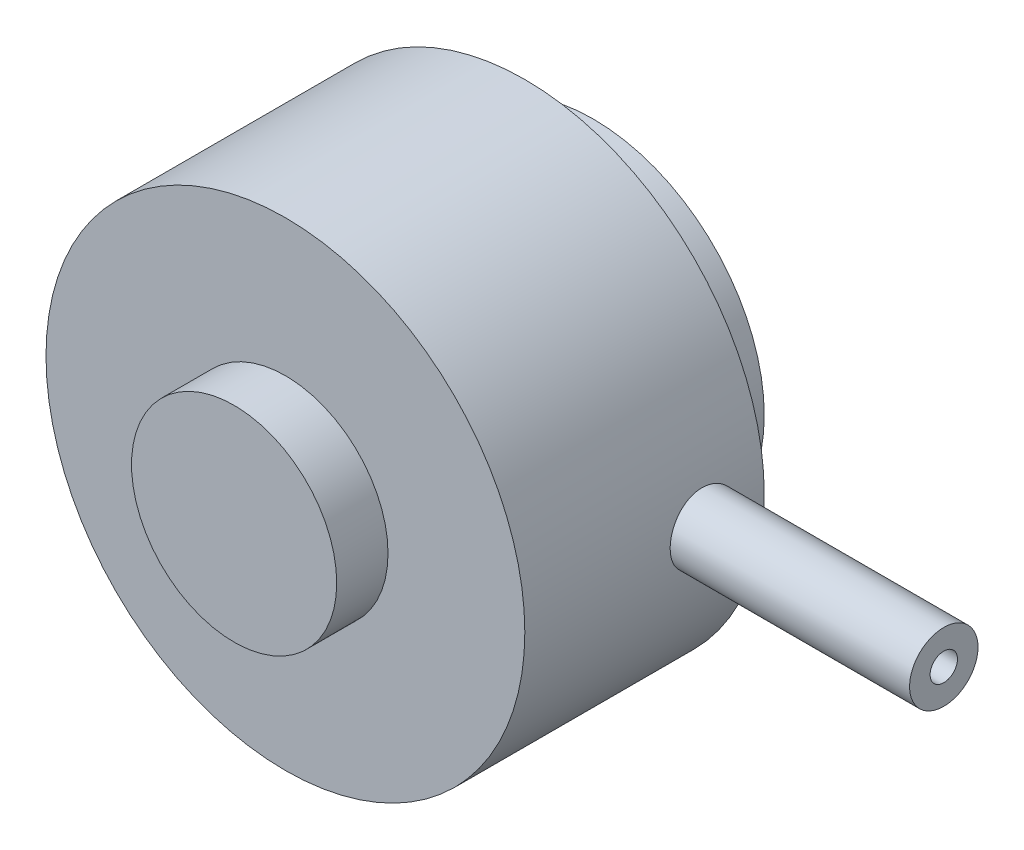
ISO-10303-21;
HEADER;
FILE_DESCRIPTION(('STEP AP214'),'2;1');
FILE_NAME('part.step','',(''),(''),'','','');
FILE_SCHEMA(('AUTOMOTIVE_DESIGN { 1 0 10303 214 1 1 1 1 }'));
ENDSEC;
DATA;
#1=APPLICATION_CONTEXT('core data for automotive mechanical design processes');
#2=APPLICATION_PROTOCOL_DEFINITION('international standard','automotive_design',2000,#1);
#3=PRODUCT_CONTEXT('',#1,'mechanical');
#4=PRODUCT('Part','Part','',(#3));
#5=PRODUCT_RELATED_PRODUCT_CATEGORY('part','',(#4));
#6=PRODUCT_DEFINITION_FORMATION('','',#4);
#7=PRODUCT_DEFINITION_CONTEXT('part definition',#1,'design');
#8=PRODUCT_DEFINITION('design','',#6,#7);
#9=PRODUCT_DEFINITION_SHAPE('','',#8);
#10=(LENGTH_UNIT() NAMED_UNIT(*) SI_UNIT(.MILLI.,.METRE.));
#11=(NAMED_UNIT(*) PLANE_ANGLE_UNIT() SI_UNIT($,.RADIAN.));
#12=(NAMED_UNIT(*) SI_UNIT($,.STERADIAN.) SOLID_ANGLE_UNIT());
#13=UNCERTAINTY_MEASURE_WITH_UNIT(LENGTH_MEASURE(1.E-05),#10,'distance_accuracy_value','');
#14=(GEOMETRIC_REPRESENTATION_CONTEXT(3) GLOBAL_UNCERTAINTY_ASSIGNED_CONTEXT((#13)) GLOBAL_UNIT_ASSIGNED_CONTEXT((#10,
#11,#12)) REPRESENTATION_CONTEXT('',''));
#15=CARTESIAN_POINT('',(0.,0.,0.));
#16=DIRECTION('',(0.,0.,1.));
#17=DIRECTION('',(1.,0.,0.));
#18=AXIS2_PLACEMENT_3D('',#15,#16,#17);
#19=CARTESIAN_POINT('',(0.,0.,9.));
#20=DIRECTION('',(0.,0.,-1.));
#21=DIRECTION('',(-1.,0.,0.));
#22=AXIS2_PLACEMENT_3D('',#19,#20,#21);
#23=CYLINDRICAL_SURFACE('',#22,7.);
#24=CARTESIAN_POINT('',(0.,0.,9.));
#25=DIRECTION('',(0.,0.,1.));
#26=DIRECTION('',(1.,0.,0.));
#27=AXIS2_PLACEMENT_3D('',#24,#25,#26);
#28=CIRCLE('',#27,7.);
#29=CARTESIAN_POINT('',(7.,0.,9.));
#30=VERTEX_POINT('',#29);
#31=EDGE_CURVE('E60',#30,#30,#28,.T.);
#32=ORIENTED_EDGE('',*,*,#31,.F.);
#33=EDGE_LOOP('',(#32));
#34=FACE_BOUND('',#33,.T.);
#35=CARTESIAN_POINT('',(0.,0.,2.));
#36=DIRECTION('',(0.,0.,1.));
#37=DIRECTION('',(1.,0.,0.));
#38=AXIS2_PLACEMENT_3D('',#35,#36,#37);
#39=CIRCLE('',#38,7.);
#40=CARTESIAN_POINT('',(7.,0.,2.));
#41=VERTEX_POINT('',#40);
#42=EDGE_CURVE('E63',#41,#41,#39,.T.);
#43=ORIENTED_EDGE('',*,*,#42,.T.);
#44=EDGE_LOOP('',(#43));
#45=FACE_BOUND('',#44,.T.);
#46=CARTESIAN_POINT('',(7.,0.,4.75));
#47=CARTESIAN_POINT('',(6.99999913522882,-0.0558653647064107,4.74999767341119));
#48=CARTESIAN_POINT('',(6.99932420200296,-0.111763905495517,4.7453027928406));
#49=CARTESIAN_POINT('',(6.99669670505877,-0.222000660368081,4.72665086376601));
#50=CARTESIAN_POINT('',(6.99474286996306,-0.276337265533478,4.71268459822962));
#51=CARTESIAN_POINT('',(6.98977730161823,-0.381838676785442,4.67591393826577));
#52=CARTESIAN_POINT('',(6.98676634168295,-0.433005769349771,4.65311600317349));
#53=CARTESIAN_POINT('',(6.98001989080586,-0.530779650240318,4.59934445710464));
#54=CARTESIAN_POINT('',(6.97628450765023,-0.57738711543865,4.56837206215042));
#55=CARTESIAN_POINT('',(6.96847539120891,-0.665058650397312,4.49889582883273));
#56=CARTESIAN_POINT('',(6.96439965767478,-0.70608559080065,4.46034535714209));
#57=CARTESIAN_POINT('',(6.95638499821218,-0.781111291768628,4.37690758546034));
#58=CARTESIAN_POINT('',(6.95244607987804,-0.815109662708697,4.33201993440348));
#59=CARTESIAN_POINT('',(6.94513156490684,-0.875255876422228,4.23693488394625));
#60=CARTESIAN_POINT('',(6.94175855199628,-0.901368125473884,4.18671475371485));
#61=CARTESIAN_POINT('',(6.93598482656287,-0.944773451668098,4.08254546050895));
#62=CARTESIAN_POINT('',(6.93358406600217,-0.962066964544983,4.02859648192668));
#63=CARTESIAN_POINT('',(6.93004619376593,-0.987229320061167,3.91888999017198));
#64=CARTESIAN_POINT('',(6.92890059523603,-0.995161488527954,3.86314728007218));
#65=CARTESIAN_POINT('',(6.92797693845422,-1.00157210007568,3.7511110945652));
#66=CARTESIAN_POINT('',(6.92819880887042,-1.00005103626979,3.69481764803928));
#67=CARTESIAN_POINT('',(6.9299772577103,-0.98765018097941,3.58372345466693));
#68=CARTESIAN_POINT('',(6.9315238110212,-0.976840681796494,3.52891467795415));
#69=CARTESIAN_POINT('',(6.93576171689508,-0.946279723214286,3.42189691371574));
#70=CARTESIAN_POINT('',(6.9384530990754,-0.926528032474813,3.36968799348884));
#71=CARTESIAN_POINT('',(6.94468857735278,-0.878569521249536,3.26913672689157));
#72=CARTESIAN_POINT('',(6.94823569081255,-0.850332693116339,3.2208088876142));
#73=CARTESIAN_POINT('',(6.95578073890064,-0.786226845720379,3.1295507878107));
#74=CARTESIAN_POINT('',(6.95977870039515,-0.750357371512553,3.08662084927006));
#75=CARTESIAN_POINT('',(6.9678193568045,-0.671617458714389,3.00696959688537));
#76=CARTESIAN_POINT('',(6.97186212884533,-0.628686537577609,2.97030805494004));
#77=CARTESIAN_POINT('',(6.97950317895594,-0.537249159400889,2.90470149877674));
#78=CARTESIAN_POINT('',(6.98310145539225,-0.48874268187249,2.87575651291603));
#79=CARTESIAN_POINT('',(6.98945135313469,-0.387481039813844,2.82640256250071));
#80=CARTESIAN_POINT('',(6.99220254306019,-0.334723727733655,2.80599794525287));
#81=CARTESIAN_POINT('',(6.99654459946019,-0.226483349377098,2.77435453068025));
#82=CARTESIAN_POINT('',(6.99813553702157,-0.171000450315641,2.76311517180909));
#83=CARTESIAN_POINT('',(6.99996847286368,-0.0594000111949728,2.75020018658979));
#84=CARTESIAN_POINT('',(7.00022206812239,-0.00329216977119546,2.74844233676575));
#85=CARTESIAN_POINT('',(6.9993832363385,0.108417425156648,2.75432240401004));
#86=CARTESIAN_POINT('',(6.99829084698658,0.164019192788029,2.76196005798254));
#87=CARTESIAN_POINT('',(6.99488996866151,0.272891208992244,2.78634597079736));
#88=CARTESIAN_POINT('',(6.99258679365044,0.326170552460061,2.80305442958978));
#89=CARTESIAN_POINT('',(6.98702187136217,0.429171472012341,2.84506586964771));
#90=CARTESIAN_POINT('',(6.98376008274315,0.47889289454054,2.87036922158957));
#91=CARTESIAN_POINT('',(6.97661188585467,0.573729847898929,2.92904690849373));
#92=CARTESIAN_POINT('',(6.97272147424604,0.618812606348984,2.96247371485273));
#93=CARTESIAN_POINT('',(6.96476223215387,0.70275764740243,3.03637603802613));
#94=CARTESIAN_POINT('',(6.96069339232073,0.741619603539291,3.07685192454233));
#95=CARTESIAN_POINT('',(6.95279940084852,0.812316823103835,3.16406835048223));
#96=CARTESIAN_POINT('',(6.94897630774254,0.844097150424189,3.21085363515026));
#97=CARTESIAN_POINT('',(6.94204235740405,0.899347843769573,3.309146593302));
#98=CARTESIAN_POINT('',(6.9389314823679,0.922818417525415,3.36065414869581));
#99=CARTESIAN_POINT('',(6.93378885130881,0.960697053792666,3.46676165225315));
#100=CARTESIAN_POINT('',(6.93175358189617,0.975134650659852,3.52135087942065));
#101=CARTESIAN_POINT('',(6.92898304632217,0.994631866000765,3.6322102805278));
#102=CARTESIAN_POINT('',(6.92824769941436,0.999692066965096,3.68848034983884));
#103=CARTESIAN_POINT('',(6.92816308872538,1.00027795187105,3.80055691326065));
#104=CARTESIAN_POINT('',(6.92880127161589,0.995889986839031,3.85636296582766));
#105=CARTESIAN_POINT('',(6.9313646210599,0.977888479253999,3.96643506202923));
#106=CARTESIAN_POINT('',(6.93328978628734,0.964274946206753,4.02070110725051));
#107=CARTESIAN_POINT('',(6.93820594738757,0.92823822782898,4.12613263255559));
#108=CARTESIAN_POINT('',(6.94119628108845,0.905820514813007,4.17730001588152));
#109=CARTESIAN_POINT('',(6.94790672863692,0.852820321015437,4.2751612224767));
#110=CARTESIAN_POINT('',(6.95162686252979,0.822237615959198,4.3218549228157));
#111=CARTESIAN_POINT('',(6.95941831326445,0.753459737315476,4.40988290926446));
#112=CARTESIAN_POINT('',(6.96349241131826,0.715200464701825,4.45116687260112));
#113=CARTESIAN_POINT('',(6.97150911027032,0.632290756660575,4.52675985371612));
#114=CARTESIAN_POINT('',(6.97545168026666,0.58763883216747,4.56106724189425));
#115=CARTESIAN_POINT('',(6.98278331246282,0.492951712266922,4.62188378601807));
#116=CARTESIAN_POINT('',(6.98616952559765,0.442890858727148,4.64835332707895));
#117=CARTESIAN_POINT('',(6.99197878037442,0.339010644185017,4.69246987200305));
#118=CARTESIAN_POINT('',(6.99440283401541,0.28519530259949,4.71012615071619));
#119=CARTESIAN_POINT('',(6.99745181502523,0.192605681998778,4.73204179345631));
#120=CARTESIAN_POINT('',(6.99840255428231,0.154406949589286,4.73876601846912));
#121=CARTESIAN_POINT('',(6.99967694328895,0.0774774606828308,4.7477459045441));
#122=CARTESIAN_POINT('',(7.00000059978196,0.0387467099115305,4.75000161365924));
#123=CARTESIAN_POINT('',(7.,0.,4.75));
#124=B_SPLINE_CURVE_WITH_KNOTS('',3,(#46,#47,#48,#49,#50,#51,#52,#53,#54,#55,#56,#57,#58,#59,
#60,#61,#62,#63,#64,#65,#66,#67,#68,#69,#70,#71,#72,#73,#74,#75,#76,#77,#78,#79,#80,#81,#82,#83,
#84,#85,#86,#87,#88,#89,#90,#91,#92,#93,#94,#95,#96,#97,#98,#99,#100,#101,#102,#103,#104,#105,
#106,#107,#108,#109,#110,#111,#112,#113,#114,#115,#116,#117,#118,#119,#120,#121,#122,#123),
.UNSPECIFIED.,.T.,.F.,(4,2,2,2,2,2,2,2,2,2,2,2,2,2,2,2,2,2,2,2,2,2,2,2,2,2,2,2,2,2,2,2,2,2,2,2,
2,2,4),(0.,0.167454526676439,0.335075775995835,0.502574660696852,0.670048642505171,
0.838587434288068,1.00713556641494,1.17643344042558,1.34572294860658,1.51386059320977,
1.68198946724779,1.84885708289861,2.01572901576745,2.1831981781095,2.35067732527464,
2.51967378353348,2.6886708628223,2.85775386243831,3.02682650172624,3.19443056043042,
3.3620299259403,3.5288997886847,3.69577684902495,3.86376187993315,4.03175572377582,
4.20101062362346,4.37026129206513,4.53895564370425,4.70763951629676,4.87478825923561,
5.0419368299494,5.20898167202542,5.37603110293353,5.54453823754737,5.71308468724557,
5.88246902499656,6.05167472923067,6.1678179205788,6.28395986295406),.UNSPECIFIED.);
#125=CARTESIAN_POINT('',(7.,0.,4.75));
#126=VERTEX_POINT('',#125);
#127=EDGE_CURVE('E10',#126,#126,#124,.T.);
#128=ORIENTED_EDGE('',*,*,#127,.F.);
#129=EDGE_LOOP('',(#128));
#130=FACE_BOUND('',#129,.T.);
#131=ADVANCED_FACE('F33',(#34,#45,#130),#23,.T.);
#132=CARTESIAN_POINT('',(0.,0.,2.));
#133=DIRECTION('',(0.,0.,-1.));
#134=DIRECTION('',(-1.,0.,0.));
#135=AXIS2_PLACEMENT_3D('',#132,#133,#134);
#136=CYLINDRICAL_SURFACE('',#135,5.);
#137=CARTESIAN_POINT('',(0.,0.,2.));
#138=DIRECTION('',(0.,0.,1.));
#139=DIRECTION('',(1.,0.,0.));
#140=AXIS2_PLACEMENT_3D('',#137,#138,#139);
#141=CIRCLE('',#140,5.);
#142=CARTESIAN_POINT('',(5.,0.,2.));
#143=VERTEX_POINT('',#142);
#144=EDGE_CURVE('E49',#143,#143,#141,.T.);
#145=ORIENTED_EDGE('',*,*,#144,.F.);
#146=EDGE_LOOP('',(#145));
#147=FACE_BOUND('',#146,.T.);
#148=CARTESIAN_POINT('',(0.,0.,0.));
#149=DIRECTION('',(0.,0.,1.));
#150=DIRECTION('',(1.,0.,0.));
#151=AXIS2_PLACEMENT_3D('',#148,#149,#150);
#152=CIRCLE('',#151,5.);
#153=CARTESIAN_POINT('',(5.,0.,0.));
#154=VERTEX_POINT('',#153);
#155=EDGE_CURVE('E54',#154,#154,#152,.T.);
#156=ORIENTED_EDGE('',*,*,#155,.T.);
#157=EDGE_LOOP('',(#156));
#158=FACE_BOUND('',#157,.T.);
#159=ADVANCED_FACE('F35',(#147,#158),#136,.T.);
#160=CARTESIAN_POINT('',(0.,0.,0.));
#161=DIRECTION('',(0.,0.,1.));
#162=DIRECTION('',(1.,0.,0.));
#163=AXIS2_PLACEMENT_3D('',#160,#161,#162);
#164=PLANE('',#163);
#165=CARTESIAN_POINT('',(0.,2.,0.));
#166=DIRECTION('',(0.,0.,-1.));
#167=DIRECTION('',(-1.,0.,0.));
#168=AXIS2_PLACEMENT_3D('',#165,#166,#167);
#169=CIRCLE('',#168,0.35);
#170=CARTESIAN_POINT('',(-0.35,2.,0.));
#171=VERTEX_POINT('',#170);
#172=EDGE_CURVE('E222',#171,#171,#169,.T.);
#173=ORIENTED_EDGE('',*,*,#172,.F.);
#174=EDGE_LOOP('',(#173));
#175=FACE_BOUND('',#174,.T.);
#176=CARTESIAN_POINT('',(0.,-2.,0.));
#177=DIRECTION('',(0.,0.,-1.));
#178=DIRECTION('',(-1.,0.,0.));
#179=AXIS2_PLACEMENT_3D('',#176,#177,#178);
#180=CIRCLE('',#179,0.35);
#181=CARTESIAN_POINT('',(-0.35,-2.,0.));
#182=VERTEX_POINT('',#181);
#183=EDGE_CURVE('E228',#182,#182,#180,.T.);
#184=ORIENTED_EDGE('',*,*,#183,.F.);
#185=EDGE_LOOP('',(#184));
#186=FACE_BOUND('',#185,.T.);
#187=CARTESIAN_POINT('',(-2.,0.,0.));
#188=DIRECTION('',(0.,0.,-1.));
#189=DIRECTION('',(-1.,0.,0.));
#190=AXIS2_PLACEMENT_3D('',#187,#188,#189);
#191=CIRCLE('',#190,0.35);
#192=CARTESIAN_POINT('',(-2.35,0.,0.));
#193=VERTEX_POINT('',#192);
#194=EDGE_CURVE('E234',#193,#193,#191,.T.);
#195=ORIENTED_EDGE('',*,*,#194,.F.);
#196=EDGE_LOOP('',(#195));
#197=FACE_BOUND('',#196,.T.);
#198=CARTESIAN_POINT('',(-2.,2.,0.));
#199=DIRECTION('',(0.,0.,-1.));
#200=DIRECTION('',(-1.,0.,0.));
#201=AXIS2_PLACEMENT_3D('',#198,#199,#200);
#202=CIRCLE('',#201,0.35);
#203=CARTESIAN_POINT('',(-2.35,2.,0.));
#204=VERTEX_POINT('',#203);
#205=EDGE_CURVE('E212',#204,#204,#202,.T.);
#206=ORIENTED_EDGE('',*,*,#205,.F.);
#207=EDGE_LOOP('',(#206));
#208=FACE_BOUND('',#207,.T.);
#209=CARTESIAN_POINT('',(2.,-2.00000000000001,0.));
#210=DIRECTION('',(0.,0.,-1.));
#211=DIRECTION('',(-1.,0.,0.));
#212=AXIS2_PLACEMENT_3D('',#209,#210,#211);
#213=CIRCLE('',#212,0.35);
#214=CARTESIAN_POINT('',(1.65,-2.00000000000001,0.));
#215=VERTEX_POINT('',#214);
#216=EDGE_CURVE('E206',#215,#215,#213,.T.);
#217=ORIENTED_EDGE('',*,*,#216,.F.);
#218=EDGE_LOOP('',(#217));
#219=FACE_BOUND('',#218,.T.);
#220=CARTESIAN_POINT('',(2.,1.99999999999999,0.));
#221=DIRECTION('',(0.,0.,-1.));
#222=DIRECTION('',(-1.,0.,0.));
#223=AXIS2_PLACEMENT_3D('',#220,#221,#222);
#224=CIRCLE('',#223,0.35);
#225=CARTESIAN_POINT('',(1.65,1.99999999999999,0.));
#226=VERTEX_POINT('',#225);
#227=EDGE_CURVE('E195',#226,#226,#224,.T.);
#228=ORIENTED_EDGE('',*,*,#227,.F.);
#229=EDGE_LOOP('',(#228));
#230=FACE_BOUND('',#229,.T.);
#231=CARTESIAN_POINT('',(2.,0.,0.));
#232=DIRECTION('',(0.,0.,-1.));
#233=DIRECTION('',(-1.,0.,0.));
#234=AXIS2_PLACEMENT_3D('',#231,#232,#233);
#235=CIRCLE('',#234,0.35);
#236=CARTESIAN_POINT('',(1.65,0.,0.));
#237=VERTEX_POINT('',#236);
#238=EDGE_CURVE('E194',#237,#237,#235,.T.);
#239=ORIENTED_EDGE('',*,*,#238,.F.);
#240=EDGE_LOOP('',(#239));
#241=FACE_BOUND('',#240,.T.);
#242=CARTESIAN_POINT('',(-2.,-2.,0.));
#243=DIRECTION('',(0.,0.,-1.));
#244=DIRECTION('',(-1.,0.,0.));
#245=AXIS2_PLACEMENT_3D('',#242,#243,#244);
#246=CIRCLE('',#245,0.35);
#247=CARTESIAN_POINT('',(-2.35,-2.,0.));
#248=VERTEX_POINT('',#247);
#249=EDGE_CURVE('E213',#248,#248,#246,.T.);
#250=ORIENTED_EDGE('',*,*,#249,.F.);
#251=EDGE_LOOP('',(#250));
#252=FACE_BOUND('',#251,.T.);
#253=CARTESIAN_POINT('',(0.,0.,0.));
#254=DIRECTION('',(0.,0.,-1.));
#255=DIRECTION('',(-1.,0.,0.));
#256=AXIS2_PLACEMENT_3D('',#253,#254,#255);
#257=CIRCLE('',#256,0.35);
#258=CARTESIAN_POINT('',(-0.35,0.,0.));
#259=VERTEX_POINT('',#258);
#260=EDGE_CURVE('E221',#259,#259,#257,.T.);
#261=ORIENTED_EDGE('',*,*,#260,.F.);
#262=EDGE_LOOP('',(#261));
#263=FACE_BOUND('',#262,.T.);
#264=ORIENTED_EDGE('',*,*,#155,.F.);
#265=EDGE_LOOP('',(#264));
#266=FACE_BOUND('',#265,.T.);
#267=ADVANCED_FACE('F69',(#175,#186,#197,#208,#219,#230,#241,#252,#263,#266),#164,.F.);
#268=CARTESIAN_POINT('',(0.,0.,9.));
#269=DIRECTION('',(0.,0.,1.));
#270=DIRECTION('',(1.,0.,0.));
#271=AXIS2_PLACEMENT_3D('',#268,#269,#270);
#272=PLANE('',#271);
#273=CARTESIAN_POINT('',(0.,0.,9.));
#274=DIRECTION('',(0.,0.,1.));
#275=DIRECTION('',(1.,0.,0.));
#276=AXIS2_PLACEMENT_3D('',#273,#274,#275);
#277=CIRCLE('',#276,3.);
#278=CARTESIAN_POINT('',(3.,0.,9.));
#279=VERTEX_POINT('',#278);
#280=EDGE_CURVE('E45',#279,#279,#277,.T.);
#281=ORIENTED_EDGE('',*,*,#280,.F.);
#282=EDGE_LOOP('',(#281));
#283=FACE_BOUND('',#282,.T.);
#284=ORIENTED_EDGE('',*,*,#31,.T.);
#285=EDGE_LOOP('',(#284));
#286=FACE_BOUND('',#285,.T.);
#287=ADVANCED_FACE('F71',(#283,#286),#272,.T.);
#288=CARTESIAN_POINT('',(0.,0.,2.));
#289=DIRECTION('',(0.,0.,1.));
#290=DIRECTION('',(1.,0.,0.));
#291=AXIS2_PLACEMENT_3D('',#288,#289,#290);
#292=PLANE('',#291);
#293=ORIENTED_EDGE('',*,*,#144,.T.);
#294=EDGE_LOOP('',(#293));
#295=FACE_BOUND('',#294,.T.);
#296=ORIENTED_EDGE('',*,*,#42,.F.);
#297=EDGE_LOOP('',(#296));
#298=FACE_BOUND('',#297,.T.);
#299=ADVANCED_FACE('F77',(#295,#298),#292,.F.);
#300=CARTESIAN_POINT('',(0.,0.,10.5));
#301=DIRECTION('',(0.,0.,-1.));
#302=DIRECTION('',(-1.,0.,0.));
#303=AXIS2_PLACEMENT_3D('',#300,#301,#302);
#304=CYLINDRICAL_SURFACE('',#303,3.);
#305=CARTESIAN_POINT('',(0.,0.,10.5));
#306=DIRECTION('',(0.,0.,1.));
#307=DIRECTION('',(1.,0.,0.));
#308=AXIS2_PLACEMENT_3D('',#305,#306,#307);
#309=CIRCLE('',#308,3.);
#310=CARTESIAN_POINT('',(3.,0.,10.5));
#311=VERTEX_POINT('',#310);
#312=EDGE_CURVE('E58',#311,#311,#309,.T.);
#313=ORIENTED_EDGE('',*,*,#312,.F.);
#314=EDGE_LOOP('',(#313));
#315=FACE_BOUND('',#314,.T.);
#316=ORIENTED_EDGE('',*,*,#280,.T.);
#317=EDGE_LOOP('',(#316));
#318=FACE_BOUND('',#317,.T.);
#319=ADVANCED_FACE('F92',(#315,#318),#304,.T.);
#320=CARTESIAN_POINT('',(0.,0.,10.5));
#321=DIRECTION('',(0.,0.,1.));
#322=DIRECTION('',(1.,0.,0.));
#323=AXIS2_PLACEMENT_3D('',#320,#321,#322);
#324=PLANE('',#323);
#325=ORIENTED_EDGE('',*,*,#312,.T.);
#326=EDGE_LOOP('',(#325));
#327=FACE_BOUND('',#326,.T.);
#328=ADVANCED_FACE('F97',(#327),#324,.T.);
#329=CARTESIAN_POINT('',(14.,0.,3.75));
#330=DIRECTION('',(-1.,0.,0.));
#331=DIRECTION('',(0.,0.,1.));
#332=AXIS2_PLACEMENT_3D('',#329,#330,#331);
#333=CYLINDRICAL_SURFACE('',#332,1.);
#334=CARTESIAN_POINT('',(14.,0.,3.75));
#335=DIRECTION('',(1.,0.,0.));
#336=DIRECTION('',(0.,0.,-1.));
#337=AXIS2_PLACEMENT_3D('',#334,#335,#336);
#338=CIRCLE('',#337,1.);
#339=CARTESIAN_POINT('',(14.,0.,2.75));
#340=VERTEX_POINT('',#339);
#341=EDGE_CURVE('E251',#340,#340,#338,.T.);
#342=ORIENTED_EDGE('',*,*,#341,.F.);
#343=EDGE_LOOP('',(#342));
#344=FACE_BOUND('',#343,.T.);
#345=ORIENTED_EDGE('',*,*,#127,.T.);
#346=EDGE_LOOP('',(#345));
#347=FACE_BOUND('',#346,.T.);
#348=ADVANCED_FACE('F100',(#344,#347),#333,.T.);
#349=CARTESIAN_POINT('',(14.,0.,3.75));
#350=DIRECTION('',(1.,0.,0.));
#351=DIRECTION('',(0.,0.,-1.));
#352=AXIS2_PLACEMENT_3D('',#349,#350,#351);
#353=PLANE('',#352);
#354=CARTESIAN_POINT('',(14.,0.,3.75));
#355=DIRECTION('',(1.,0.,0.));
#356=DIRECTION('',(0.,0.,-1.));
#357=AXIS2_PLACEMENT_3D('',#354,#355,#356);
#358=CIRCLE('',#357,0.4);
#359=CARTESIAN_POINT('',(14.,0.,3.35));
#360=VERTEX_POINT('',#359);
#361=EDGE_CURVE('E245',#360,#360,#358,.T.);
#362=ORIENTED_EDGE('',*,*,#361,.F.);
#363=EDGE_LOOP('',(#362));
#364=FACE_BOUND('',#363,.T.);
#365=ORIENTED_EDGE('',*,*,#341,.T.);
#366=EDGE_LOOP('',(#365));
#367=FACE_BOUND('',#366,.T.);
#368=ADVANCED_FACE('F105',(#364,#367),#353,.T.);
#369=CARTESIAN_POINT('',(6.,0.,3.75));
#370=DIRECTION('',(1.,0.,0.));
#371=DIRECTION('',(0.,0.,-1.));
#372=AXIS2_PLACEMENT_3D('',#369,#370,#371);
#373=CYLINDRICAL_SURFACE('',#372,0.4);
#374=CARTESIAN_POINT('',(6.,0.,3.75));
#375=DIRECTION('',(1.,0.,0.));
#376=DIRECTION('',(0.,0.,-1.));
#377=AXIS2_PLACEMENT_3D('',#374,#375,#376);
#378=CIRCLE('',#377,0.4);
#379=CARTESIAN_POINT('',(6.,0.,3.35));
#380=VERTEX_POINT('',#379);
#381=EDGE_CURVE('E248',#380,#380,#378,.T.);
#382=ORIENTED_EDGE('',*,*,#381,.F.);
#383=EDGE_LOOP('',(#382));
#384=FACE_BOUND('',#383,.T.);
#385=ORIENTED_EDGE('',*,*,#361,.T.);
#386=EDGE_LOOP('',(#385));
#387=FACE_BOUND('',#386,.T.);
#388=ADVANCED_FACE('F109',(#384,#387),#373,.F.);
#389=CARTESIAN_POINT('',(6.,0.,3.75));
#390=DIRECTION('',(1.,0.,0.));
#391=DIRECTION('',(0.,0.,-1.));
#392=AXIS2_PLACEMENT_3D('',#389,#390,#391);
#393=PLANE('',#392);
#394=ORIENTED_EDGE('',*,*,#381,.T.);
#395=EDGE_LOOP('',(#394));
#396=FACE_BOUND('',#395,.T.);
#397=ADVANCED_FACE('F113',(#396),#393,.T.);
#398=CARTESIAN_POINT('',(0.,0.,0.4));
#399=DIRECTION('',(0.,0.,-1.));
#400=DIRECTION('',(-1.,0.,0.));
#401=AXIS2_PLACEMENT_3D('',#398,#399,#400);
#402=CYLINDRICAL_SURFACE('',#401,0.35);
#403=CARTESIAN_POINT('',(0.,0.,0.4));
#404=DIRECTION('',(0.,0.,-1.));
#405=DIRECTION('',(-1.,0.,0.));
#406=AXIS2_PLACEMENT_3D('',#403,#404,#405);
#407=CIRCLE('',#406,0.35);
#408=CARTESIAN_POINT('',(-0.35,0.,0.4));
#409=VERTEX_POINT('',#408);
#410=EDGE_CURVE('E242',#409,#409,#407,.T.);
#411=ORIENTED_EDGE('',*,*,#410,.F.);
#412=EDGE_LOOP('',(#411));
#413=FACE_BOUND('',#412,.T.);
#414=ORIENTED_EDGE('',*,*,#260,.T.);
#415=EDGE_LOOP('',(#414));
#416=FACE_BOUND('',#415,.T.);
#417=ADVANCED_FACE('F117',(#413,#416),#402,.F.);
#418=CARTESIAN_POINT('',(0.,0.,0.4));
#419=DIRECTION('',(0.,0.,-1.));
#420=DIRECTION('',(-1.,0.,0.));
#421=AXIS2_PLACEMENT_3D('',#418,#419,#420);
#422=PLANE('',#421);
#423=ORIENTED_EDGE('',*,*,#410,.T.);
#424=EDGE_LOOP('',(#423));
#425=FACE_BOUND('',#424,.T.);
#426=ADVANCED_FACE('F121',(#425),#422,.T.);
#427=CARTESIAN_POINT('',(-2.,-2.,0.4));
#428=DIRECTION('',(0.,0.,-1.));
#429=DIRECTION('',(-1.,0.,0.));
#430=AXIS2_PLACEMENT_3D('',#427,#428,#429);
#431=CYLINDRICAL_SURFACE('',#430,0.35);
#432=CARTESIAN_POINT('',(-2.,-2.,0.4));
#433=DIRECTION('',(0.,0.,-1.));
#434=DIRECTION('',(-1.,0.,0.));
#435=AXIS2_PLACEMENT_3D('',#432,#433,#434);
#436=CIRCLE('',#435,0.35);
#437=CARTESIAN_POINT('',(-2.35,-2.,0.4));
#438=VERTEX_POINT('',#437);
#439=EDGE_CURVE('E209',#438,#438,#436,.T.);
#440=ORIENTED_EDGE('',*,*,#439,.F.);
#441=EDGE_LOOP('',(#440));
#442=FACE_BOUND('',#441,.T.);
#443=ORIENTED_EDGE('',*,*,#249,.T.);
#444=EDGE_LOOP('',(#443));
#445=FACE_BOUND('',#444,.T.);
#446=ADVANCED_FACE('F125',(#442,#445),#431,.F.);
#447=CARTESIAN_POINT('',(-2.,-2.,0.4));
#448=DIRECTION('',(0.,0.,-1.));
#449=DIRECTION('',(-1.,0.,0.));
#450=AXIS2_PLACEMENT_3D('',#447,#448,#449);
#451=PLANE('',#450);
#452=ORIENTED_EDGE('',*,*,#439,.T.);
#453=EDGE_LOOP('',(#452));
#454=FACE_BOUND('',#453,.T.);
#455=ADVANCED_FACE('F164',(#454),#451,.T.);
#456=CARTESIAN_POINT('',(2.,0.,0.4));
#457=DIRECTION('',(0.,0.,-1.));
#458=DIRECTION('',(-1.,0.,0.));
#459=AXIS2_PLACEMENT_3D('',#456,#457,#458);
#460=CYLINDRICAL_SURFACE('',#459,0.35);
#461=CARTESIAN_POINT('',(2.,0.,0.4));
#462=DIRECTION('',(0.,0.,-1.));
#463=DIRECTION('',(-1.,0.,0.));
#464=AXIS2_PLACEMENT_3D('',#461,#462,#463);
#465=CIRCLE('',#464,0.35);
#466=CARTESIAN_POINT('',(1.65,0.,0.4));
#467=VERTEX_POINT('',#466);
#468=EDGE_CURVE('E198',#467,#467,#465,.T.);
#469=ORIENTED_EDGE('',*,*,#468,.F.);
#470=EDGE_LOOP('',(#469));
#471=FACE_BOUND('',#470,.T.);
#472=ORIENTED_EDGE('',*,*,#238,.T.);
#473=EDGE_LOOP('',(#472));
#474=FACE_BOUND('',#473,.T.);
#475=ADVANCED_FACE('F160',(#471,#474),#460,.F.);
#476=CARTESIAN_POINT('',(2.,0.,0.4));
#477=DIRECTION('',(0.,0.,-1.));
#478=DIRECTION('',(-1.,0.,0.));
#479=AXIS2_PLACEMENT_3D('',#476,#477,#478);
#480=PLANE('',#479);
#481=ORIENTED_EDGE('',*,*,#468,.T.);
#482=EDGE_LOOP('',(#481));
#483=FACE_BOUND('',#482,.T.);
#484=ADVANCED_FACE('F163',(#483),#480,.T.);
#485=CARTESIAN_POINT('',(2.,1.99999999999999,0.4));
#486=DIRECTION('',(0.,0.,-1.));
#487=DIRECTION('',(-1.,0.,0.));
#488=AXIS2_PLACEMENT_3D('',#485,#486,#487);
#489=CYLINDRICAL_SURFACE('',#488,0.35);
#490=CARTESIAN_POINT('',(2.,1.99999999999999,0.4));
#491=DIRECTION('',(0.,0.,-1.));
#492=DIRECTION('',(-1.,0.,0.));
#493=AXIS2_PLACEMENT_3D('',#490,#491,#492);
#494=CIRCLE('',#493,0.35);
#495=CARTESIAN_POINT('',(1.65,1.99999999999999,0.4));
#496=VERTEX_POINT('',#495);
#497=EDGE_CURVE('E193',#496,#496,#494,.T.);
#498=ORIENTED_EDGE('',*,*,#497,.F.);
#499=EDGE_LOOP('',(#498));
#500=FACE_BOUND('',#499,.T.);
#501=ORIENTED_EDGE('',*,*,#227,.T.);
#502=EDGE_LOOP('',(#501));
#503=FACE_BOUND('',#502,.T.);
#504=ADVANCED_FACE('F168',(#500,#503),#489,.F.);
#505=CARTESIAN_POINT('',(2.,1.99999999999999,0.4));
#506=DIRECTION('',(0.,0.,-1.));
#507=DIRECTION('',(-1.,0.,0.));
#508=AXIS2_PLACEMENT_3D('',#505,#506,#507);
#509=PLANE('',#508);
#510=ORIENTED_EDGE('',*,*,#497,.T.);
#511=EDGE_LOOP('',(#510));
#512=FACE_BOUND('',#511,.T.);
#513=ADVANCED_FACE('F179',(#512),#509,.T.);
#514=CARTESIAN_POINT('',(2.,-2.00000000000001,0.4));
#515=DIRECTION('',(0.,0.,-1.));
#516=DIRECTION('',(-1.,0.,0.));
#517=AXIS2_PLACEMENT_3D('',#514,#515,#516);
#518=CYLINDRICAL_SURFACE('',#517,0.35);
#519=CARTESIAN_POINT('',(2.,-2.00000000000001,0.4));
#520=DIRECTION('',(0.,0.,-1.));
#521=DIRECTION('',(-1.,0.,0.));
#522=AXIS2_PLACEMENT_3D('',#519,#520,#521);
#523=CIRCLE('',#522,0.35);
#524=CARTESIAN_POINT('',(1.65,-2.00000000000001,0.4));
#525=VERTEX_POINT('',#524);
#526=EDGE_CURVE('E201',#525,#525,#523,.T.);
#527=ORIENTED_EDGE('',*,*,#526,.F.);
#528=EDGE_LOOP('',(#527));
#529=FACE_BOUND('',#528,.T.);
#530=ORIENTED_EDGE('',*,*,#216,.T.);
#531=EDGE_LOOP('',(#530));
#532=FACE_BOUND('',#531,.T.);
#533=ADVANCED_FACE('F176',(#529,#532),#518,.F.);
#534=CARTESIAN_POINT('',(2.,-2.00000000000001,0.4));
#535=DIRECTION('',(0.,0.,-1.));
#536=DIRECTION('',(-1.,0.,0.));
#537=AXIS2_PLACEMENT_3D('',#534,#535,#536);
#538=PLANE('',#537);
#539=ORIENTED_EDGE('',*,*,#526,.T.);
#540=EDGE_LOOP('',(#539));
#541=FACE_BOUND('',#540,.T.);
#542=ADVANCED_FACE('F131',(#541),#538,.T.);
#543=CARTESIAN_POINT('',(-2.,2.,0.4));
#544=DIRECTION('',(0.,0.,-1.));
#545=DIRECTION('',(-1.,0.,0.));
#546=AXIS2_PLACEMENT_3D('',#543,#544,#545);
#547=CYLINDRICAL_SURFACE('',#546,0.35);
#548=CARTESIAN_POINT('',(-2.,2.,0.4));
#549=DIRECTION('',(0.,0.,-1.));
#550=DIRECTION('',(-1.,0.,0.));
#551=AXIS2_PLACEMENT_3D('',#548,#549,#550);
#552=CIRCLE('',#551,0.35);
#553=CARTESIAN_POINT('',(-2.35,2.,0.4));
#554=VERTEX_POINT('',#553);
#555=EDGE_CURVE('E237',#554,#554,#552,.T.);
#556=ORIENTED_EDGE('',*,*,#555,.F.);
#557=EDGE_LOOP('',(#556));
#558=FACE_BOUND('',#557,.T.);
#559=ORIENTED_EDGE('',*,*,#205,.T.);
#560=EDGE_LOOP('',(#559));
#561=FACE_BOUND('',#560,.T.);
#562=ADVANCED_FACE('F127',(#558,#561),#547,.F.);
#563=CARTESIAN_POINT('',(-2.,2.,0.4));
#564=DIRECTION('',(0.,0.,-1.));
#565=DIRECTION('',(-1.,0.,0.));
#566=AXIS2_PLACEMENT_3D('',#563,#564,#565);
#567=PLANE('',#566);
#568=ORIENTED_EDGE('',*,*,#555,.T.);
#569=EDGE_LOOP('',(#568));
#570=FACE_BOUND('',#569,.T.);
#571=ADVANCED_FACE('F130',(#570),#567,.T.);
#572=CARTESIAN_POINT('',(-2.,0.,0.4));
#573=DIRECTION('',(0.,0.,-1.));
#574=DIRECTION('',(-1.,0.,0.));
#575=AXIS2_PLACEMENT_3D('',#572,#573,#574);
#576=CYLINDRICAL_SURFACE('',#575,0.35);
#577=CARTESIAN_POINT('',(-2.,0.,0.4));
#578=DIRECTION('',(0.,0.,-1.));
#579=DIRECTION('',(-1.,0.,0.));
#580=AXIS2_PLACEMENT_3D('',#577,#578,#579);
#581=CIRCLE('',#580,0.35);
#582=CARTESIAN_POINT('',(-2.35,0.,0.4));
#583=VERTEX_POINT('',#582);
#584=EDGE_CURVE('E231',#583,#583,#581,.T.);
#585=ORIENTED_EDGE('',*,*,#584,.F.);
#586=EDGE_LOOP('',(#585));
#587=FACE_BOUND('',#586,.T.);
#588=ORIENTED_EDGE('',*,*,#194,.T.);
#589=EDGE_LOOP('',(#588));
#590=FACE_BOUND('',#589,.T.);
#591=ADVANCED_FACE('F135',(#587,#590),#576,.F.);
#592=CARTESIAN_POINT('',(-2.,0.,0.4));
#593=DIRECTION('',(0.,0.,-1.));
#594=DIRECTION('',(-1.,0.,0.));
#595=AXIS2_PLACEMENT_3D('',#592,#593,#594);
#596=PLANE('',#595);
#597=ORIENTED_EDGE('',*,*,#584,.T.);
#598=EDGE_LOOP('',(#597));
#599=FACE_BOUND('',#598,.T.);
#600=ADVANCED_FACE('F139',(#599),#596,.T.);
#601=CARTESIAN_POINT('',(0.,-2.,0.4));
#602=DIRECTION('',(0.,0.,-1.));
#603=DIRECTION('',(-1.,0.,0.));
#604=AXIS2_PLACEMENT_3D('',#601,#602,#603);
#605=CYLINDRICAL_SURFACE('',#604,0.35);
#606=CARTESIAN_POINT('',(0.,-2.,0.4));
#607=DIRECTION('',(0.,0.,-1.));
#608=DIRECTION('',(-1.,0.,0.));
#609=AXIS2_PLACEMENT_3D('',#606,#607,#608);
#610=CIRCLE('',#609,0.35);
#611=CARTESIAN_POINT('',(-0.35,-2.,0.4));
#612=VERTEX_POINT('',#611);
#613=EDGE_CURVE('E225',#612,#612,#610,.T.);
#614=ORIENTED_EDGE('',*,*,#613,.F.);
#615=EDGE_LOOP('',(#614));
#616=FACE_BOUND('',#615,.T.);
#617=ORIENTED_EDGE('',*,*,#183,.T.);
#618=EDGE_LOOP('',(#617));
#619=FACE_BOUND('',#618,.T.);
#620=ADVANCED_FACE('F143',(#616,#619),#605,.F.);
#621=CARTESIAN_POINT('',(0.,-2.,0.4));
#622=DIRECTION('',(0.,0.,-1.));
#623=DIRECTION('',(-1.,0.,0.));
#624=AXIS2_PLACEMENT_3D('',#621,#622,#623);
#625=PLANE('',#624);
#626=ORIENTED_EDGE('',*,*,#613,.T.);
#627=EDGE_LOOP('',(#626));
#628=FACE_BOUND('',#627,.T.);
#629=ADVANCED_FACE('F147',(#628),#625,.T.);
#630=CARTESIAN_POINT('',(0.,2.,0.4));
#631=DIRECTION('',(0.,0.,-1.));
#632=DIRECTION('',(-1.,0.,0.));
#633=AXIS2_PLACEMENT_3D('',#630,#631,#632);
#634=CYLINDRICAL_SURFACE('',#633,0.35);
#635=CARTESIAN_POINT('',(0.,2.,0.4));
#636=DIRECTION('',(0.,0.,-1.));
#637=DIRECTION('',(-1.,0.,0.));
#638=AXIS2_PLACEMENT_3D('',#635,#636,#637);
#639=CIRCLE('',#638,0.35);
#640=CARTESIAN_POINT('',(-0.35,2.,0.4));
#641=VERTEX_POINT('',#640);
#642=EDGE_CURVE('E218',#641,#641,#639,.T.);
#643=ORIENTED_EDGE('',*,*,#642,.F.);
#644=EDGE_LOOP('',(#643));
#645=FACE_BOUND('',#644,.T.);
#646=ORIENTED_EDGE('',*,*,#172,.T.);
#647=EDGE_LOOP('',(#646));
#648=FACE_BOUND('',#647,.T.);
#649=ADVANCED_FACE('F151',(#645,#648),#634,.F.);
#650=CARTESIAN_POINT('',(0.,2.,0.4));
#651=DIRECTION('',(0.,0.,-1.));
#652=DIRECTION('',(-1.,0.,0.));
#653=AXIS2_PLACEMENT_3D('',#650,#651,#652);
#654=PLANE('',#653);
#655=ORIENTED_EDGE('',*,*,#642,.T.);
#656=EDGE_LOOP('',(#655));
#657=FACE_BOUND('',#656,.T.);
#658=ADVANCED_FACE('F155',(#657),#654,.T.);
#659=CLOSED_SHELL('',(#131,#159,#267,#287,#299,#319,#328,#348,#368,#388,#397,#417,#426,#446,
#455,#475,#484,#504,#513,#533,#542,#562,#571,#591,#600,#620,#629,#649,#658));
#660=MANIFOLD_SOLID_BREP('B2',#659);
#661=ADVANCED_BREP_SHAPE_REPRESENTATION('',(#18,#660),#14);
#662=SHAPE_DEFINITION_REPRESENTATION(#9,#661);
ENDSEC;
END-ISO-10303-21;
